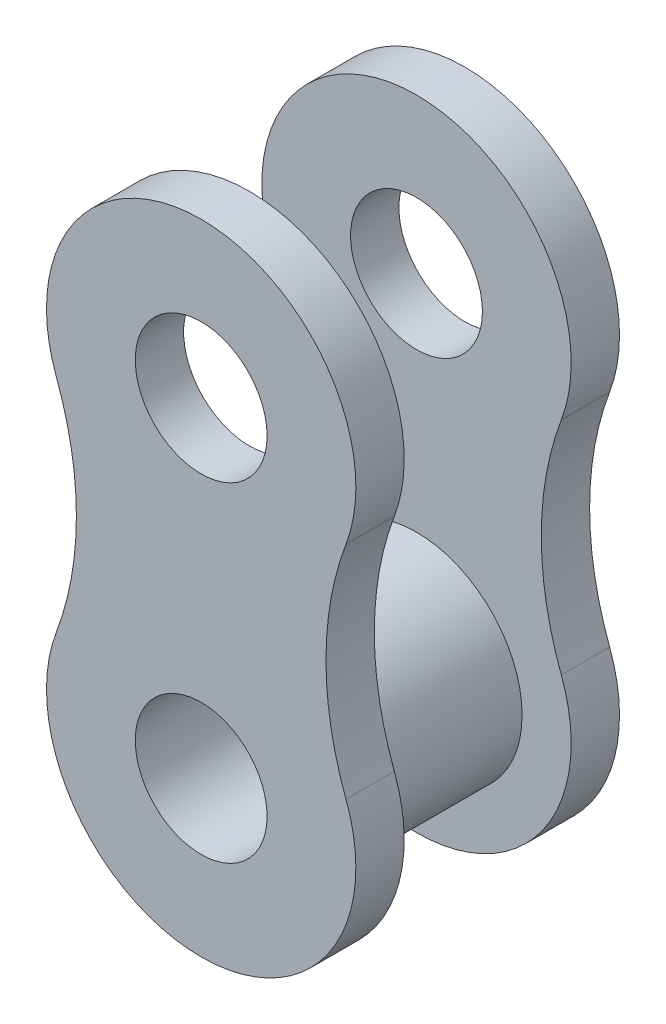
ISO-10303-21;
HEADER;
FILE_DESCRIPTION(('STEP AP214'),'2;1');
FILE_NAME('part.step','',(''),(''),'','','');
FILE_SCHEMA(('AUTOMOTIVE_DESIGN { 1 0 10303 214 1 1 1 1 }'));
ENDSEC;
DATA;
#1=APPLICATION_CONTEXT('core data for automotive mechanical design processes');
#2=APPLICATION_PROTOCOL_DEFINITION('international standard','automotive_design',2000,#1);
#3=PRODUCT_CONTEXT('',#1,'mechanical');
#4=PRODUCT('Part','Part','',(#3));
#5=PRODUCT_RELATED_PRODUCT_CATEGORY('part','',(#4));
#6=PRODUCT_DEFINITION_FORMATION('','',#4);
#7=PRODUCT_DEFINITION_CONTEXT('part definition',#1,'design');
#8=PRODUCT_DEFINITION('design','',#6,#7);
#9=PRODUCT_DEFINITION_SHAPE('','',#8);
#10=(LENGTH_UNIT() NAMED_UNIT(*) SI_UNIT(.MILLI.,.METRE.));
#11=(NAMED_UNIT(*) PLANE_ANGLE_UNIT() SI_UNIT($,.RADIAN.));
#12=(NAMED_UNIT(*) SI_UNIT($,.STERADIAN.) SOLID_ANGLE_UNIT());
#13=UNCERTAINTY_MEASURE_WITH_UNIT(LENGTH_MEASURE(1.E-05),#10,'distance_accuracy_value','');
#14=(GEOMETRIC_REPRESENTATION_CONTEXT(3) GLOBAL_UNCERTAINTY_ASSIGNED_CONTEXT((#13)) GLOBAL_UNIT_ASSIGNED_CONTEXT((#10,
#11,#12)) REPRESENTATION_CONTEXT('',''));
#15=CARTESIAN_POINT('',(0.,0.,0.));
#16=DIRECTION('',(0.,0.,1.));
#17=DIRECTION('',(1.,0.,0.));
#18=AXIS2_PLACEMENT_3D('',#15,#16,#17);
#19=CARTESIAN_POINT('',(0.,0.,1.397));
#20=DIRECTION('',(0.,0.,1.));
#21=DIRECTION('',(1.,0.,0.));
#22=AXIS2_PLACEMENT_3D('',#19,#20,#21);
#23=PLANE('',#22);
#24=CARTESIAN_POINT('',(0.,9.525,1.397));
#25=DIRECTION('',(0.,0.,1.));
#26=DIRECTION('',(1.,0.,0.));
#27=AXIS2_PLACEMENT_3D('',#24,#25,#26);
#28=CIRCLE('',#27,1.905);
#29=CARTESIAN_POINT('',(1.905,9.525,1.397));
#30=VERTEX_POINT('',#29);
#31=EDGE_CURVE('E181',#30,#30,#28,.T.);
#32=ORIENTED_EDGE('',*,*,#31,.F.);
#33=EDGE_LOOP('',(#32));
#34=FACE_BOUND('',#33,.T.);
#35=CARTESIAN_POINT('',(0.,0.,1.397));
#36=DIRECTION('',(0.,0.,1.));
#37=DIRECTION('',(1.,0.,0.));
#38=AXIS2_PLACEMENT_3D('',#35,#36,#37);
#39=CIRCLE('',#38,4.4704);
#40=CARTESIAN_POINT('',(-4.18576595540466,1.56966223327675,1.397));
#41=VERTEX_POINT('',#40);
#42=CARTESIAN_POINT('',(4.18576595540466,1.56966223327675,1.397));
#43=VERTEX_POINT('',#42);
#44=EDGE_CURVE('E173',#41,#43,#39,.T.);
#45=ORIENTED_EDGE('',*,*,#44,.T.);
#46=CARTESIAN_POINT('',(12.7,4.7625,1.397));
#47=DIRECTION('',(0.,0.,1.));
#48=DIRECTION('',(1.,0.,0.));
#49=AXIS2_PLACEMENT_3D('',#46,#47,#48);
#50=CIRCLE('',#49,9.09320594569158);
#51=CARTESIAN_POINT('',(4.18576595540466,7.95533776672325,1.397));
#52=VERTEX_POINT('',#51);
#53=EDGE_CURVE('E86',#43,#52,#50,.F.);
#54=ORIENTED_EDGE('',*,*,#53,.T.);
#55=CARTESIAN_POINT('',(0.,9.525,1.397));
#56=DIRECTION('',(0.,0.,1.));
#57=DIRECTION('',(1.,0.,0.));
#58=AXIS2_PLACEMENT_3D('',#55,#56,#57);
#59=CIRCLE('',#58,4.4704);
#60=CARTESIAN_POINT('',(-4.18576595540466,7.95533776672325,1.397));
#61=VERTEX_POINT('',#60);
#62=EDGE_CURVE('E177',#52,#61,#59,.T.);
#63=ORIENTED_EDGE('',*,*,#62,.T.);
#64=CARTESIAN_POINT('',(-12.7,4.7625,1.397));
#65=DIRECTION('',(0.,0.,1.));
#66=DIRECTION('',(1.,0.,0.));
#67=AXIS2_PLACEMENT_3D('',#64,#65,#66);
#68=CIRCLE('',#67,9.09320594569158);
#69=EDGE_CURVE('E179',#41,#61,#68,.T.);
#70=ORIENTED_EDGE('',*,*,#69,.F.);
#71=EDGE_LOOP('',(#45,#54,#63,#70));
#72=FACE_BOUND('',#71,.T.);
#73=CARTESIAN_POINT('',(0.,0.,1.397));
#74=DIRECTION('',(0.,0.,1.));
#75=DIRECTION('',(1.,0.,0.));
#76=AXIS2_PLACEMENT_3D('',#73,#74,#75);
#77=CIRCLE('',#76,3.05212700439173);
#78=CARTESIAN_POINT('',(3.05212700439173,0.,1.397));
#79=VERTEX_POINT('',#78);
#80=EDGE_CURVE('E125',#79,#79,#77,.T.);
#81=ORIENTED_EDGE('',*,*,#80,.F.);
#82=EDGE_LOOP('',(#81));
#83=FACE_BOUND('',#82,.T.);
#84=ADVANCED_FACE('F42',(#34,#72,#83),#23,.T.);
#85=CARTESIAN_POINT('',(0.,0.,1.397));
#86=DIRECTION('',(0.,0.,-1.));
#87=DIRECTION('',(-1.,0.,0.));
#88=AXIS2_PLACEMENT_3D('',#85,#86,#87);
#89=CYLINDRICAL_SURFACE('',#88,4.4704);
#90=CARTESIAN_POINT('',(0.,0.,0.));
#91=DIRECTION('',(0.,0.,1.));
#92=DIRECTION('',(1.,0.,0.));
#93=AXIS2_PLACEMENT_3D('',#90,#91,#92);
#94=CIRCLE('',#93,4.4704);
#95=CARTESIAN_POINT('',(-4.18576595540466,1.56966223327675,0.));
#96=VERTEX_POINT('',#95);
#97=CARTESIAN_POINT('',(4.18576595540466,1.56966223327675,0.));
#98=VERTEX_POINT('',#97);
#99=EDGE_CURVE('E186',#96,#98,#94,.T.);
#100=ORIENTED_EDGE('',*,*,#99,.T.);
#101=DIRECTION('',(0.,0.,-1.));
#102=VECTOR('',#101,1.);
#103=CARTESIAN_POINT('',(4.18576595540466,1.56966223327675,1.397));
#104=LINE('',#103,#102);
#105=EDGE_CURVE('E11',#43,#98,#104,.T.);
#106=ORIENTED_EDGE('',*,*,#105,.F.);
#107=ORIENTED_EDGE('',*,*,#44,.F.);
#108=DIRECTION('',(0.,0.,-1.));
#109=VECTOR('',#108,1.);
#110=CARTESIAN_POINT('',(-4.18576595540466,1.56966223327675,1.397));
#111=LINE('',#110,#109);
#112=EDGE_CURVE('E59',#41,#96,#111,.T.);
#113=ORIENTED_EDGE('',*,*,#112,.T.);
#114=EDGE_LOOP('',(#100,#106,#107,#113));
#115=FACE_BOUND('',#114,.T.);
#116=ADVANCED_FACE('F219',(#115),#89,.T.);
#117=CARTESIAN_POINT('',(12.7,4.7625,1.397));
#118=DIRECTION('',(0.,0.,-1.));
#119=DIRECTION('',(-1.,0.,0.));
#120=AXIS2_PLACEMENT_3D('',#117,#118,#119);
#121=CYLINDRICAL_SURFACE('',#120,9.09320594569158);
#122=CARTESIAN_POINT('',(12.7,4.7625,0.));
#123=DIRECTION('',(0.,0.,1.));
#124=DIRECTION('',(1.,0.,0.));
#125=AXIS2_PLACEMENT_3D('',#122,#123,#124);
#126=CIRCLE('',#125,9.09320594569158);
#127=CARTESIAN_POINT('',(4.18576595540466,7.95533776672325,0.));
#128=VERTEX_POINT('',#127);
#129=EDGE_CURVE('E188',#98,#128,#126,.F.);
#130=ORIENTED_EDGE('',*,*,#129,.T.);
#131=DIRECTION('',(0.,0.,-1.));
#132=VECTOR('',#131,1.);
#133=CARTESIAN_POINT('',(4.18576595540466,7.95533776672325,1.397));
#134=LINE('',#133,#132);
#135=EDGE_CURVE('E51',#52,#128,#134,.T.);
#136=ORIENTED_EDGE('',*,*,#135,.F.);
#137=ORIENTED_EDGE('',*,*,#53,.F.);
#138=ORIENTED_EDGE('',*,*,#105,.T.);
#139=EDGE_LOOP('',(#130,#136,#137,#138));
#140=FACE_BOUND('',#139,.T.);
#141=ADVANCED_FACE('F215',(#140),#121,.F.);
#142=CARTESIAN_POINT('',(0.,9.525,1.397));
#143=DIRECTION('',(0.,0.,-1.));
#144=DIRECTION('',(-1.,0.,0.));
#145=AXIS2_PLACEMENT_3D('',#142,#143,#144);
#146=CYLINDRICAL_SURFACE('',#145,4.4704);
#147=CARTESIAN_POINT('',(0.,9.525,0.));
#148=DIRECTION('',(0.,0.,1.));
#149=DIRECTION('',(1.,0.,0.));
#150=AXIS2_PLACEMENT_3D('',#147,#148,#149);
#151=CIRCLE('',#150,4.4704);
#152=CARTESIAN_POINT('',(-4.18576595540466,7.95533776672325,0.));
#153=VERTEX_POINT('',#152);
#154=EDGE_CURVE('E190',#128,#153,#151,.T.);
#155=ORIENTED_EDGE('',*,*,#154,.T.);
#156=DIRECTION('',(0.,0.,-1.));
#157=VECTOR('',#156,1.);
#158=CARTESIAN_POINT('',(-4.18576595540466,7.95533776672325,1.397));
#159=LINE('',#158,#157);
#160=EDGE_CURVE('E75',#61,#153,#159,.T.);
#161=ORIENTED_EDGE('',*,*,#160,.F.);
#162=ORIENTED_EDGE('',*,*,#62,.F.);
#163=ORIENTED_EDGE('',*,*,#135,.T.);
#164=EDGE_LOOP('',(#155,#161,#162,#163));
#165=FACE_BOUND('',#164,.T.);
#166=ADVANCED_FACE('F202',(#165),#146,.T.);
#167=CARTESIAN_POINT('',(-12.7,4.7625,1.397));
#168=DIRECTION('',(0.,0.,-1.));
#169=DIRECTION('',(-1.,0.,0.));
#170=AXIS2_PLACEMENT_3D('',#167,#168,#169);
#171=CYLINDRICAL_SURFACE('',#170,9.09320594569158);
#172=CARTESIAN_POINT('',(-12.7,4.7625,0.));
#173=DIRECTION('',(0.,0.,1.));
#174=DIRECTION('',(1.,0.,0.));
#175=AXIS2_PLACEMENT_3D('',#172,#173,#174);
#176=CIRCLE('',#175,9.09320594569158);
#177=EDGE_CURVE('E192',#96,#153,#176,.T.);
#178=ORIENTED_EDGE('',*,*,#177,.F.);
#179=ORIENTED_EDGE('',*,*,#112,.F.);
#180=ORIENTED_EDGE('',*,*,#69,.T.);
#181=ORIENTED_EDGE('',*,*,#160,.T.);
#182=EDGE_LOOP('',(#178,#179,#180,#181));
#183=FACE_BOUND('',#182,.T.);
#184=ADVANCED_FACE('F206',(#183),#171,.F.);
#185=CARTESIAN_POINT('',(0.,0.,1.397));
#186=DIRECTION('',(0.,0.,-1.));
#187=DIRECTION('',(-1.,0.,0.));
#188=AXIS2_PLACEMENT_3D('',#185,#186,#187);
#189=CYLINDRICAL_SURFACE('',#188,1.905);
#190=CARTESIAN_POINT('',(0.,0.,0.));
#191=DIRECTION('',(0.,0.,1.));
#192=DIRECTION('',(1.,0.,0.));
#193=AXIS2_PLACEMENT_3D('',#190,#191,#192);
#194=CIRCLE('',#193,1.905);
#195=CARTESIAN_POINT('',(1.905,0.,0.));
#196=VERTEX_POINT('',#195);
#197=EDGE_CURVE('E170',#196,#196,#194,.T.);
#198=ORIENTED_EDGE('',*,*,#197,.F.);
#199=EDGE_LOOP('',(#198));
#200=FACE_BOUND('',#199,.T.);
#201=CARTESIAN_POINT('',(0.,0.,7.62));
#202=DIRECTION('',(0.,0.,1.));
#203=DIRECTION('',(1.,0.,0.));
#204=AXIS2_PLACEMENT_3D('',#201,#202,#203);
#205=CIRCLE('',#204,1.905);
#206=CARTESIAN_POINT('',(1.905,0.,7.62));
#207=VERTEX_POINT('',#206);
#208=EDGE_CURVE('E152',#207,#207,#205,.T.);
#209=ORIENTED_EDGE('',*,*,#208,.T.);
#210=EDGE_LOOP('',(#209));
#211=FACE_BOUND('',#210,.T.);
#212=ADVANCED_FACE('F44',(#200,#211),#189,.F.);
#213=CARTESIAN_POINT('',(0.,9.525,1.397));
#214=DIRECTION('',(0.,0.,-1.));
#215=DIRECTION('',(-1.,0.,0.));
#216=AXIS2_PLACEMENT_3D('',#213,#214,#215);
#217=CYLINDRICAL_SURFACE('',#216,1.905);
#218=ORIENTED_EDGE('',*,*,#31,.T.);
#219=EDGE_LOOP('',(#218));
#220=FACE_BOUND('',#219,.T.);
#221=CARTESIAN_POINT('',(0.,9.525,0.));
#222=DIRECTION('',(0.,0.,1.));
#223=DIRECTION('',(1.,0.,0.));
#224=AXIS2_PLACEMENT_3D('',#221,#222,#223);
#225=CIRCLE('',#224,1.905);
#226=CARTESIAN_POINT('',(1.905,9.525,0.));
#227=VERTEX_POINT('',#226);
#228=EDGE_CURVE('E175',#227,#227,#225,.T.);
#229=ORIENTED_EDGE('',*,*,#228,.F.);
#230=EDGE_LOOP('',(#229));
#231=FACE_BOUND('',#230,.T.);
#232=ADVANCED_FACE('F213',(#220,#231),#217,.F.);
#233=CARTESIAN_POINT('',(0.,0.,0.));
#234=DIRECTION('',(0.,0.,1.));
#235=DIRECTION('',(1.,0.,0.));
#236=AXIS2_PLACEMENT_3D('',#233,#234,#235);
#237=PLANE('',#236);
#238=ORIENTED_EDGE('',*,*,#197,.T.);
#239=EDGE_LOOP('',(#238));
#240=FACE_BOUND('',#239,.T.);
#241=ORIENTED_EDGE('',*,*,#99,.F.);
#242=ORIENTED_EDGE('',*,*,#177,.T.);
#243=ORIENTED_EDGE('',*,*,#154,.F.);
#244=ORIENTED_EDGE('',*,*,#129,.F.);
#245=EDGE_LOOP('',(#241,#242,#243,#244));
#246=FACE_BOUND('',#245,.T.);
#247=ORIENTED_EDGE('',*,*,#228,.T.);
#248=EDGE_LOOP('',(#247));
#249=FACE_BOUND('',#248,.T.);
#250=ADVANCED_FACE('F204',(#240,#246,#249),#237,.F.);
#251=CARTESIAN_POINT('',(0.,0.,6.223));
#252=DIRECTION('',(0.,0.,-1.));
#253=DIRECTION('',(-1.,0.,0.));
#254=AXIS2_PLACEMENT_3D('',#251,#252,#253);
#255=CYLINDRICAL_SURFACE('',#254,3.05212700439173);
#256=CARTESIAN_POINT('',(0.,0.,6.223));
#257=DIRECTION('',(0.,0.,1.));
#258=DIRECTION('',(1.,0.,0.));
#259=AXIS2_PLACEMENT_3D('',#256,#257,#258);
#260=CIRCLE('',#259,3.05212700439173);
#261=CARTESIAN_POINT('',(3.05212700439173,0.,6.223));
#262=VERTEX_POINT('',#261);
#263=EDGE_CURVE('E167',#262,#262,#260,.T.);
#264=ORIENTED_EDGE('',*,*,#263,.F.);
#265=EDGE_LOOP('',(#264));
#266=FACE_BOUND('',#265,.T.);
#267=ORIENTED_EDGE('',*,*,#80,.T.);
#268=EDGE_LOOP('',(#267));
#269=FACE_BOUND('',#268,.T.);
#270=ADVANCED_FACE('F229',(#266,#269),#255,.T.);
#271=CARTESIAN_POINT('',(0.,0.,6.223));
#272=DIRECTION('',(0.,0.,1.));
#273=DIRECTION('',(1.,0.,0.));
#274=AXIS2_PLACEMENT_3D('',#271,#272,#273);
#275=CYLINDRICAL_SURFACE('',#274,4.4704);
#276=CARTESIAN_POINT('',(0.,0.,7.62));
#277=DIRECTION('',(0.,0.,1.));
#278=DIRECTION('',(1.,0.,0.));
#279=AXIS2_PLACEMENT_3D('',#276,#277,#278);
#280=CIRCLE('',#279,4.4704);
#281=CARTESIAN_POINT('',(-4.18576595540466,1.56966223327675,7.62));
#282=VERTEX_POINT('',#281);
#283=CARTESIAN_POINT('',(4.18576595540466,1.56966223327675,7.62));
#284=VERTEX_POINT('',#283);
#285=EDGE_CURVE('E121',#282,#284,#280,.T.);
#286=ORIENTED_EDGE('',*,*,#285,.F.);
#287=DIRECTION('',(0.,0.,1.));
#288=VECTOR('',#287,1.);
#289=CARTESIAN_POINT('',(-4.18576595540466,1.56966223327675,6.223));
#290=LINE('',#289,#288);
#291=CARTESIAN_POINT('',(-4.18576595540466,1.56966223327675,6.223));
#292=VERTEX_POINT('',#291);
#293=EDGE_CURVE('E114',#292,#282,#290,.T.);
#294=ORIENTED_EDGE('',*,*,#293,.F.);
#295=CARTESIAN_POINT('',(0.,0.,6.223));
#296=DIRECTION('',(0.,0.,1.));
#297=DIRECTION('',(1.,0.,0.));
#298=AXIS2_PLACEMENT_3D('',#295,#296,#297);
#299=CIRCLE('',#298,4.4704);
#300=CARTESIAN_POINT('',(4.18576595540466,1.56966223327675,6.223));
#301=VERTEX_POINT('',#300);
#302=EDGE_CURVE('E118',#292,#301,#299,.T.);
#303=ORIENTED_EDGE('',*,*,#302,.T.);
#304=DIRECTION('',(0.,0.,1.));
#305=VECTOR('',#304,1.);
#306=CARTESIAN_POINT('',(4.18576595540466,1.56966223327675,6.223));
#307=LINE('',#306,#305);
#308=EDGE_CURVE('E151',#301,#284,#307,.T.);
#309=ORIENTED_EDGE('',*,*,#308,.T.);
#310=EDGE_LOOP('',(#286,#294,#303,#309));
#311=FACE_BOUND('',#310,.T.);
#312=ADVANCED_FACE('F116',(#311),#275,.T.);
#313=CARTESIAN_POINT('',(-12.7,4.7625,6.223));
#314=DIRECTION('',(0.,0.,1.));
#315=DIRECTION('',(1.,0.,0.));
#316=AXIS2_PLACEMENT_3D('',#313,#314,#315);
#317=CYLINDRICAL_SURFACE('',#316,9.09320594569158);
#318=CARTESIAN_POINT('',(-12.7,4.7625,7.62));
#319=DIRECTION('',(0.,0.,1.));
#320=DIRECTION('',(1.,0.,0.));
#321=AXIS2_PLACEMENT_3D('',#318,#319,#320);
#322=CIRCLE('',#321,9.09320594569158);
#323=CARTESIAN_POINT('',(-4.18576595540466,7.95533776672325,7.62));
#324=VERTEX_POINT('',#323);
#325=EDGE_CURVE('E156',#282,#324,#322,.T.);
#326=ORIENTED_EDGE('',*,*,#325,.T.);
#327=DIRECTION('',(0.,0.,1.));
#328=VECTOR('',#327,1.);
#329=CARTESIAN_POINT('',(-4.18576595540466,7.95533776672325,6.223));
#330=LINE('',#329,#328);
#331=CARTESIAN_POINT('',(-4.18576595540466,7.95533776672325,6.223));
#332=VERTEX_POINT('',#331);
#333=EDGE_CURVE('E126',#332,#324,#330,.T.);
#334=ORIENTED_EDGE('',*,*,#333,.F.);
#335=CARTESIAN_POINT('',(-12.7,4.7625,6.223));
#336=DIRECTION('',(0.,0.,1.));
#337=DIRECTION('',(1.,0.,0.));
#338=AXIS2_PLACEMENT_3D('',#335,#336,#337);
#339=CIRCLE('',#338,9.09320594569158);
#340=EDGE_CURVE('E129',#292,#332,#339,.T.);
#341=ORIENTED_EDGE('',*,*,#340,.F.);
#342=ORIENTED_EDGE('',*,*,#293,.T.);
#343=EDGE_LOOP('',(#326,#334,#341,#342));
#344=FACE_BOUND('',#343,.T.);
#345=ADVANCED_FACE('F130',(#344),#317,.F.);
#346=CARTESIAN_POINT('',(0.,9.525,6.223));
#347=DIRECTION('',(0.,0.,1.));
#348=DIRECTION('',(1.,0.,0.));
#349=AXIS2_PLACEMENT_3D('',#346,#347,#348);
#350=CYLINDRICAL_SURFACE('',#349,4.4704);
#351=CARTESIAN_POINT('',(0.,9.525,7.62));
#352=DIRECTION('',(0.,0.,1.));
#353=DIRECTION('',(1.,0.,0.));
#354=AXIS2_PLACEMENT_3D('',#351,#352,#353);
#355=CIRCLE('',#354,4.4704);
#356=CARTESIAN_POINT('',(4.18576595540466,7.95533776672325,7.62));
#357=VERTEX_POINT('',#356);
#358=EDGE_CURVE('E158',#357,#324,#355,.T.);
#359=ORIENTED_EDGE('',*,*,#358,.F.);
#360=DIRECTION('',(0.,0.,1.));
#361=VECTOR('',#360,1.);
#362=CARTESIAN_POINT('',(4.18576595540466,7.95533776672325,6.223));
#363=LINE('',#362,#361);
#364=CARTESIAN_POINT('',(4.18576595540466,7.95533776672325,6.223));
#365=VERTEX_POINT('',#364);
#366=EDGE_CURVE('E164',#365,#357,#363,.T.);
#367=ORIENTED_EDGE('',*,*,#366,.F.);
#368=CARTESIAN_POINT('',(0.,9.525,6.223));
#369=DIRECTION('',(0.,0.,1.));
#370=DIRECTION('',(1.,0.,0.));
#371=AXIS2_PLACEMENT_3D('',#368,#369,#370);
#372=CIRCLE('',#371,4.4704);
#373=EDGE_CURVE('E134',#365,#332,#372,.T.);
#374=ORIENTED_EDGE('',*,*,#373,.T.);
#375=ORIENTED_EDGE('',*,*,#333,.T.);
#376=EDGE_LOOP('',(#359,#367,#374,#375));
#377=FACE_BOUND('',#376,.T.);
#378=ADVANCED_FACE('F262',(#377),#350,.T.);
#379=CARTESIAN_POINT('',(12.7,4.7625,6.223));
#380=DIRECTION('',(0.,0.,1.));
#381=DIRECTION('',(1.,0.,0.));
#382=AXIS2_PLACEMENT_3D('',#379,#380,#381);
#383=CYLINDRICAL_SURFACE('',#382,9.09320594569158);
#384=CARTESIAN_POINT('',(12.7,4.7625,7.62));
#385=DIRECTION('',(0.,0.,1.));
#386=DIRECTION('',(1.,0.,0.));
#387=AXIS2_PLACEMENT_3D('',#384,#385,#386);
#388=CIRCLE('',#387,9.09320594569158);
#389=EDGE_CURVE('E143',#284,#357,#388,.F.);
#390=ORIENTED_EDGE('',*,*,#389,.F.);
#391=ORIENTED_EDGE('',*,*,#308,.F.);
#392=CARTESIAN_POINT('',(12.7,4.7625,6.223));
#393=DIRECTION('',(0.,0.,1.));
#394=DIRECTION('',(1.,0.,0.));
#395=AXIS2_PLACEMENT_3D('',#392,#393,#394);
#396=CIRCLE('',#395,9.09320594569158);
#397=EDGE_CURVE('E139',#301,#365,#396,.F.);
#398=ORIENTED_EDGE('',*,*,#397,.T.);
#399=ORIENTED_EDGE('',*,*,#366,.T.);
#400=EDGE_LOOP('',(#390,#391,#398,#399));
#401=FACE_BOUND('',#400,.T.);
#402=ADVANCED_FACE('F269',(#401),#383,.F.);
#403=CARTESIAN_POINT('',(0.,9.525,6.223));
#404=DIRECTION('',(0.,0.,1.));
#405=DIRECTION('',(1.,0.,0.));
#406=AXIS2_PLACEMENT_3D('',#403,#404,#405);
#407=CYLINDRICAL_SURFACE('',#406,1.905);
#408=CARTESIAN_POINT('',(0.,9.525,6.223));
#409=DIRECTION('',(0.,0.,1.));
#410=DIRECTION('',(1.,0.,0.));
#411=AXIS2_PLACEMENT_3D('',#408,#409,#410);
#412=CIRCLE('',#411,1.905);
#413=CARTESIAN_POINT('',(1.905,9.525,6.223));
#414=VERTEX_POINT('',#413);
#415=EDGE_CURVE('E148',#414,#414,#412,.T.);
#416=ORIENTED_EDGE('',*,*,#415,.F.);
#417=EDGE_LOOP('',(#416));
#418=FACE_BOUND('',#417,.T.);
#419=CARTESIAN_POINT('',(0.,9.525,7.62));
#420=DIRECTION('',(0.,0.,1.));
#421=DIRECTION('',(1.,0.,0.));
#422=AXIS2_PLACEMENT_3D('',#419,#420,#421);
#423=CIRCLE('',#422,1.905);
#424=CARTESIAN_POINT('',(1.905,9.525,7.62));
#425=VERTEX_POINT('',#424);
#426=EDGE_CURVE('E140',#425,#425,#423,.T.);
#427=ORIENTED_EDGE('',*,*,#426,.T.);
#428=EDGE_LOOP('',(#427));
#429=FACE_BOUND('',#428,.T.);
#430=ADVANCED_FACE('F277',(#418,#429),#407,.F.);
#431=CARTESIAN_POINT('',(0.,0.,6.223));
#432=DIRECTION('',(0.,0.,-1.));
#433=DIRECTION('',(1.,0.,0.));
#434=AXIS2_PLACEMENT_3D('',#431,#432,#433);
#435=PLANE('',#434);
#436=ORIENTED_EDGE('',*,*,#263,.T.);
#437=EDGE_LOOP('',(#436));
#438=FACE_BOUND('',#437,.T.);
#439=ORIENTED_EDGE('',*,*,#302,.F.);
#440=ORIENTED_EDGE('',*,*,#340,.T.);
#441=ORIENTED_EDGE('',*,*,#373,.F.);
#442=ORIENTED_EDGE('',*,*,#397,.F.);
#443=EDGE_LOOP('',(#439,#440,#441,#442));
#444=FACE_BOUND('',#443,.T.);
#445=ORIENTED_EDGE('',*,*,#415,.T.);
#446=EDGE_LOOP('',(#445));
#447=FACE_BOUND('',#446,.T.);
#448=ADVANCED_FACE('F136',(#438,#444,#447),#435,.T.);
#449=CARTESIAN_POINT('',(0.,0.,7.62));
#450=DIRECTION('',(0.,0.,-1.));
#451=DIRECTION('',(1.,0.,0.));
#452=AXIS2_PLACEMENT_3D('',#449,#450,#451);
#453=PLANE('',#452);
#454=ORIENTED_EDGE('',*,*,#208,.F.);
#455=EDGE_LOOP('',(#454));
#456=FACE_BOUND('',#455,.T.);
#457=ORIENTED_EDGE('',*,*,#285,.T.);
#458=ORIENTED_EDGE('',*,*,#389,.T.);
#459=ORIENTED_EDGE('',*,*,#358,.T.);
#460=ORIENTED_EDGE('',*,*,#325,.F.);
#461=EDGE_LOOP('',(#457,#458,#459,#460));
#462=FACE_BOUND('',#461,.T.);
#463=ORIENTED_EDGE('',*,*,#426,.F.);
#464=EDGE_LOOP('',(#463));
#465=FACE_BOUND('',#464,.T.);
#466=ADVANCED_FACE('F292',(#456,#462,#465),#453,.F.);
#467=CLOSED_SHELL('',(#84,#116,#141,#166,#184,#212,#232,#250,#270,#312,#345,#378,#402,#430,#448,#466));
#468=MANIFOLD_SOLID_BREP('B2',#467);
#469=ADVANCED_BREP_SHAPE_REPRESENTATION('',(#18,#468),#14);
#470=SHAPE_DEFINITION_REPRESENTATION(#9,#469);
ENDSEC;
END-ISO-10303-21;
